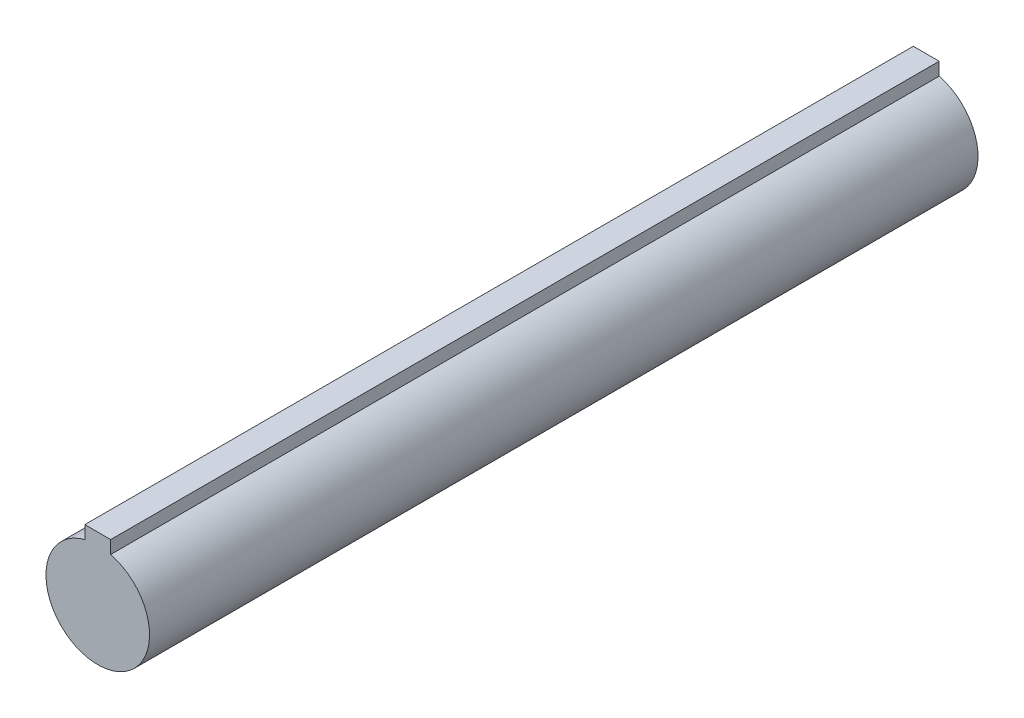
ISO-10303-21;
HEADER;
FILE_DESCRIPTION(('STEP AP214'),'2;1');
FILE_NAME('part.step','',(''),(''),'','','');
FILE_SCHEMA(('AUTOMOTIVE_DESIGN { 1 0 10303 214 1 1 1 1 }'));
ENDSEC;
DATA;
#1=APPLICATION_CONTEXT('core data for automotive mechanical design processes');
#2=APPLICATION_PROTOCOL_DEFINITION('international standard','automotive_design',2000,#1);
#3=PRODUCT_CONTEXT('',#1,'mechanical');
#4=PRODUCT('Part','Part','',(#3));
#5=PRODUCT_RELATED_PRODUCT_CATEGORY('part','',(#4));
#6=PRODUCT_DEFINITION_FORMATION('','',#4);
#7=PRODUCT_DEFINITION_CONTEXT('part definition',#1,'design');
#8=PRODUCT_DEFINITION('design','',#6,#7);
#9=PRODUCT_DEFINITION_SHAPE('','',#8);
#10=(LENGTH_UNIT() NAMED_UNIT(*) SI_UNIT(.MILLI.,.METRE.));
#11=(NAMED_UNIT(*) PLANE_ANGLE_UNIT() SI_UNIT($,.RADIAN.));
#12=(NAMED_UNIT(*) SI_UNIT($,.STERADIAN.) SOLID_ANGLE_UNIT());
#13=UNCERTAINTY_MEASURE_WITH_UNIT(LENGTH_MEASURE(1.E-05),#10,'distance_accuracy_value','');
#14=(GEOMETRIC_REPRESENTATION_CONTEXT(3) GLOBAL_UNCERTAINTY_ASSIGNED_CONTEXT((#13)) GLOBAL_UNIT_ASSIGNED_CONTEXT((#10,
#11,#12)) REPRESENTATION_CONTEXT('',''));
#15=CARTESIAN_POINT('',(0.,0.,0.));
#16=DIRECTION('',(0.,0.,1.));
#17=DIRECTION('',(1.,0.,0.));
#18=AXIS2_PLACEMENT_3D('',#15,#16,#17);
#19=CARTESIAN_POINT('',(-1.5875,7.73586106210427,101.6));
#20=DIRECTION('',(0.,-1.,0.));
#21=DIRECTION('',(0.,0.,-1.));
#22=AXIS2_PLACEMENT_3D('',#19,#20,#21);
#23=PLANE('',#22);
#24=DIRECTION('',(-1.,0.,0.));
#25=VECTOR('',#24,1.);
#26=CARTESIAN_POINT('',(-1.5875,7.73586106210427,0.));
#27=LINE('',#26,#25);
#28=CARTESIAN_POINT('',(1.5875,7.73586106210427,0.));
#29=VERTEX_POINT('',#28);
#30=CARTESIAN_POINT('',(-1.5875,7.73586106210427,0.));
#31=VERTEX_POINT('',#30);
#32=EDGE_CURVE('E113',#29,#31,#27,.T.);
#33=ORIENTED_EDGE('',*,*,#32,.T.);
#34=DIRECTION('',(0.,0.,-1.));
#35=VECTOR('',#34,1.);
#36=CARTESIAN_POINT('',(-1.5875,7.73586106210427,101.6));
#37=LINE('',#36,#35);
#38=CARTESIAN_POINT('',(-1.5875,7.73586106210427,101.6));
#39=VERTEX_POINT('',#38);
#40=EDGE_CURVE('E11',#39,#31,#37,.T.);
#41=ORIENTED_EDGE('',*,*,#40,.F.);
#42=DIRECTION('',(-1.,0.,0.));
#43=VECTOR('',#42,1.);
#44=CARTESIAN_POINT('',(-1.5875,7.73586106210427,101.6));
#45=LINE('',#44,#43);
#46=CARTESIAN_POINT('',(1.5875,7.73586106210427,101.6));
#47=VERTEX_POINT('',#46);
#48=EDGE_CURVE('E97',#47,#39,#45,.T.);
#49=ORIENTED_EDGE('',*,*,#48,.F.);
#50=DIRECTION('',(0.,0.,-1.));
#51=VECTOR('',#50,1.);
#52=CARTESIAN_POINT('',(1.5875,7.73586106210427,101.6));
#53=LINE('',#52,#51);
#54=EDGE_CURVE('E109',#47,#29,#53,.T.);
#55=ORIENTED_EDGE('',*,*,#54,.T.);
#56=EDGE_LOOP('',(#33,#41,#49,#55));
#57=FACE_BOUND('',#56,.T.);
#58=ADVANCED_FACE('F45',(#57),#23,.F.);
#59=CARTESIAN_POINT('',(-1.5875,6.14836106210427,101.6));
#60=DIRECTION('',(1.,0.,0.));
#61=DIRECTION('',(0.,0.,-1.));
#62=AXIS2_PLACEMENT_3D('',#59,#60,#61);
#63=PLANE('',#62);
#64=DIRECTION('',(0.,-1.,0.));
#65=VECTOR('',#64,1.);
#66=CARTESIAN_POINT('',(-1.5875,6.14836106210427,0.));
#67=LINE('',#66,#65);
#68=CARTESIAN_POINT('',(-1.5875,6.14836106210427,0.));
#69=VERTEX_POINT('',#68);
#70=EDGE_CURVE('E102',#31,#69,#67,.T.);
#71=ORIENTED_EDGE('',*,*,#70,.T.);
#72=DIRECTION('',(0.,0.,-1.));
#73=VECTOR('',#72,1.);
#74=CARTESIAN_POINT('',(-1.5875,6.14836106210427,101.6));
#75=LINE('',#74,#73);
#76=CARTESIAN_POINT('',(-1.5875,6.14836106210427,101.6));
#77=VERTEX_POINT('',#76);
#78=EDGE_CURVE('E54',#77,#69,#75,.T.);
#79=ORIENTED_EDGE('',*,*,#78,.F.);
#80=DIRECTION('',(0.,-1.,0.));
#81=VECTOR('',#80,1.);
#82=CARTESIAN_POINT('',(-1.5875,6.14836106210427,101.6));
#83=LINE('',#82,#81);
#84=EDGE_CURVE('E92',#39,#77,#83,.T.);
#85=ORIENTED_EDGE('',*,*,#84,.F.);
#86=ORIENTED_EDGE('',*,*,#40,.T.);
#87=EDGE_LOOP('',(#71,#79,#85,#86));
#88=FACE_BOUND('',#87,.T.);
#89=ADVANCED_FACE('F101',(#88),#63,.F.);
#90=CARTESIAN_POINT('',(0.,0.,101.6));
#91=DIRECTION('',(0.,0.,-1.));
#92=DIRECTION('',(-1.,0.,0.));
#93=AXIS2_PLACEMENT_3D('',#90,#91,#92);
#94=CYLINDRICAL_SURFACE('',#93,6.35);
#95=CARTESIAN_POINT('',(0.,0.,0.));
#96=DIRECTION('',(0.,0.,1.));
#97=DIRECTION('',(1.,0.,0.));
#98=AXIS2_PLACEMENT_3D('',#95,#96,#97);
#99=CIRCLE('',#98,6.35);
#100=CARTESIAN_POINT('',(1.5875,6.14836106210427,0.));
#101=VERTEX_POINT('',#100);
#102=EDGE_CURVE('E79',#69,#101,#99,.T.);
#103=ORIENTED_EDGE('',*,*,#102,.T.);
#104=DIRECTION('',(0.,0.,-1.));
#105=VECTOR('',#104,1.);
#106=CARTESIAN_POINT('',(1.5875,6.14836106210427,101.6));
#107=LINE('',#106,#105);
#108=CARTESIAN_POINT('',(1.5875,6.14836106210427,101.6));
#109=VERTEX_POINT('',#108);
#110=EDGE_CURVE('E104',#109,#101,#107,.T.);
#111=ORIENTED_EDGE('',*,*,#110,.F.);
#112=CARTESIAN_POINT('',(0.,0.,101.6));
#113=DIRECTION('',(0.,0.,1.));
#114=DIRECTION('',(1.,0.,0.));
#115=AXIS2_PLACEMENT_3D('',#112,#113,#114);
#116=CIRCLE('',#115,6.35);
#117=EDGE_CURVE('E95',#77,#109,#116,.T.);
#118=ORIENTED_EDGE('',*,*,#117,.F.);
#119=ORIENTED_EDGE('',*,*,#78,.T.);
#120=EDGE_LOOP('',(#103,#111,#118,#119));
#121=FACE_BOUND('',#120,.T.);
#122=ADVANCED_FACE('F105',(#121),#94,.T.);
#123=CARTESIAN_POINT('',(1.5875,7.73586106210427,101.6));
#124=DIRECTION('',(-1.,0.,0.));
#125=DIRECTION('',(0.,0.,1.));
#126=AXIS2_PLACEMENT_3D('',#123,#124,#125);
#127=PLANE('',#126);
#128=DIRECTION('',(0.,1.,0.));
#129=VECTOR('',#128,1.);
#130=CARTESIAN_POINT('',(1.5875,7.73586106210427,0.));
#131=LINE('',#130,#129);
#132=EDGE_CURVE('E85',#101,#29,#131,.T.);
#133=ORIENTED_EDGE('',*,*,#132,.T.);
#134=ORIENTED_EDGE('',*,*,#54,.F.);
#135=DIRECTION('',(0.,1.,0.));
#136=VECTOR('',#135,1.);
#137=CARTESIAN_POINT('',(1.5875,7.73586106210427,101.6));
#138=LINE('',#137,#136);
#139=EDGE_CURVE('E62',#109,#47,#138,.T.);
#140=ORIENTED_EDGE('',*,*,#139,.F.);
#141=ORIENTED_EDGE('',*,*,#110,.T.);
#142=EDGE_LOOP('',(#133,#134,#140,#141));
#143=FACE_BOUND('',#142,.T.);
#144=ADVANCED_FACE('F126',(#143),#127,.F.);
#145=CARTESIAN_POINT('',(0.,0.,101.6));
#146=DIRECTION('',(0.,0.,1.));
#147=DIRECTION('',(1.,0.,0.));
#148=AXIS2_PLACEMENT_3D('',#145,#146,#147);
#149=PLANE('',#148);
#150=ORIENTED_EDGE('',*,*,#48,.T.);
#151=ORIENTED_EDGE('',*,*,#84,.T.);
#152=ORIENTED_EDGE('',*,*,#117,.T.);
#153=ORIENTED_EDGE('',*,*,#139,.T.);
#154=EDGE_LOOP('',(#150,#151,#152,#153));
#155=FACE_BOUND('',#154,.T.);
#156=ADVANCED_FACE('F93',(#155),#149,.T.);
#157=CARTESIAN_POINT('',(0.,0.,0.));
#158=DIRECTION('',(0.,0.,1.));
#159=DIRECTION('',(1.,0.,0.));
#160=AXIS2_PLACEMENT_3D('',#157,#158,#159);
#161=PLANE('',#160);
#162=ORIENTED_EDGE('',*,*,#32,.F.);
#163=ORIENTED_EDGE('',*,*,#132,.F.);
#164=ORIENTED_EDGE('',*,*,#102,.F.);
#165=ORIENTED_EDGE('',*,*,#70,.F.);
#166=EDGE_LOOP('',(#162,#163,#164,#165));
#167=FACE_BOUND('',#166,.T.);
#168=ADVANCED_FACE('F129',(#167),#161,.F.);
#169=CLOSED_SHELL('',(#58,#89,#122,#144,#156,#168));
#170=MANIFOLD_SOLID_BREP('B2',#169);
#171=ADVANCED_BREP_SHAPE_REPRESENTATION('',(#18,#170),#14);
#172=SHAPE_DEFINITION_REPRESENTATION(#9,#171);
ENDSEC;
END-ISO-10303-21;
